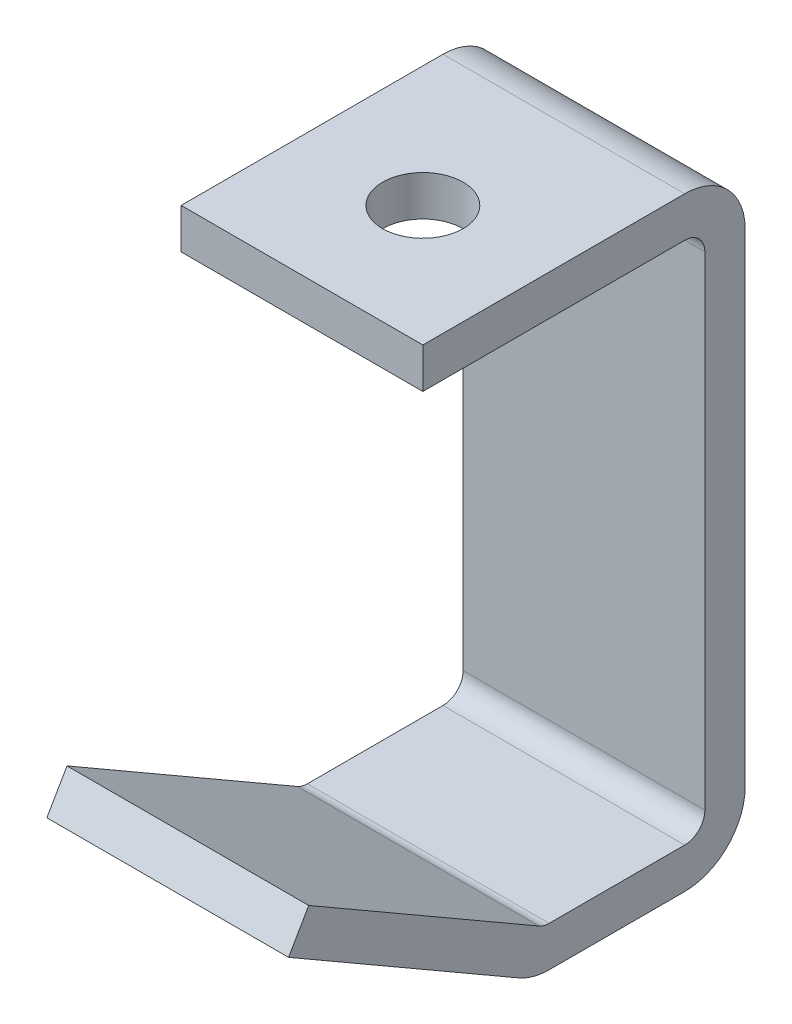
ISO-10303-21;
HEADER;
FILE_DESCRIPTION(('STEP AP214'),'2;1');
FILE_NAME('part.step','',(''),(''),'','','');
FILE_SCHEMA(('AUTOMOTIVE_DESIGN { 1 0 10303 214 1 1 1 1 }'));
ENDSEC;
DATA;
#1=APPLICATION_CONTEXT('core data for automotive mechanical design processes');
#2=APPLICATION_PROTOCOL_DEFINITION('international standard','automotive_design',2000,#1);
#3=PRODUCT_CONTEXT('',#1,'mechanical');
#4=PRODUCT('Part','Part','',(#3));
#5=PRODUCT_RELATED_PRODUCT_CATEGORY('part','',(#4));
#6=PRODUCT_DEFINITION_FORMATION('','',#4);
#7=PRODUCT_DEFINITION_CONTEXT('part definition',#1,'design');
#8=PRODUCT_DEFINITION('design','',#6,#7);
#9=PRODUCT_DEFINITION_SHAPE('','',#8);
#10=(LENGTH_UNIT() NAMED_UNIT(*) SI_UNIT(.MILLI.,.METRE.));
#11=(NAMED_UNIT(*) PLANE_ANGLE_UNIT() SI_UNIT($,.RADIAN.));
#12=(NAMED_UNIT(*) SI_UNIT($,.STERADIAN.) SOLID_ANGLE_UNIT());
#13=UNCERTAINTY_MEASURE_WITH_UNIT(LENGTH_MEASURE(1.E-05),#10,'distance_accuracy_value','');
#14=(GEOMETRIC_REPRESENTATION_CONTEXT(3) GLOBAL_UNCERTAINTY_ASSIGNED_CONTEXT((#13)) GLOBAL_UNIT_ASSIGNED_CONTEXT((#10,
#11,#12)) REPRESENTATION_CONTEXT('',''));
#15=CARTESIAN_POINT('',(0.,0.,0.));
#16=DIRECTION('',(0.,0.,1.));
#17=DIRECTION('',(1.,0.,0.));
#18=AXIS2_PLACEMENT_3D('',#15,#16,#17);
#19=CARTESIAN_POINT('',(38.1,95.25,6.34999999999995));
#20=DIRECTION('',(0.,0.,-1.));
#21=DIRECTION('',(0.,1.,0.));
#22=AXIS2_PLACEMENT_3D('',#19,#20,#21);
#23=PLANE('',#22);
#24=DIRECTION('',(0.,-1.,0.));
#25=VECTOR('',#24,1.);
#26=CARTESIAN_POINT('',(0.,95.25,6.34999999999995));
#27=LINE('',#26,#25);
#28=CARTESIAN_POINT('',(0.,85.7250000000001,6.34999999999996));
#29=VERTEX_POINT('',#28);
#30=CARTESIAN_POINT('',(0.,9.52499999999998,6.35000000000001));
#31=VERTEX_POINT('',#30);
#32=EDGE_CURVE('E182',#29,#31,#27,.T.);
#33=ORIENTED_EDGE('',*,*,#32,.T.);
#34=DIRECTION('',(1.,0.,0.));
#35=VECTOR('',#34,1.);
#36=CARTESIAN_POINT('',(38.1,9.52499999999998,6.35000000000001));
#37=LINE('',#36,#35);
#38=CARTESIAN_POINT('',(38.1,9.52499999999998,6.35000000000001));
#39=VERTEX_POINT('',#38);
#40=EDGE_CURVE('E227',#31,#39,#37,.T.);
#41=ORIENTED_EDGE('',*,*,#40,.T.);
#42=DIRECTION('',(0.,-1.,0.));
#43=VECTOR('',#42,1.);
#44=CARTESIAN_POINT('',(38.1,95.25,6.34999999999995));
#45=LINE('',#44,#43);
#46=CARTESIAN_POINT('',(38.1,85.7250000000001,6.34999999999996));
#47=VERTEX_POINT('',#46);
#48=EDGE_CURVE('E185',#47,#39,#45,.T.);
#49=ORIENTED_EDGE('',*,*,#48,.F.);
#50=DIRECTION('',(1.,0.,0.));
#51=VECTOR('',#50,1.);
#52=CARTESIAN_POINT('',(0.,85.7250000000001,6.34999999999996));
#53=LINE('',#52,#51);
#54=EDGE_CURVE('E223',#47,#29,#53,.F.);
#55=ORIENTED_EDGE('',*,*,#54,.T.);
#56=EDGE_LOOP('',(#33,#41,#49,#55));
#57=FACE_BOUND('',#56,.T.);
#58=ADVANCED_FACE('F35',(#57),#23,.F.);
#59=CARTESIAN_POINT('',(0.,6.34999999999998,0.));
#60=DIRECTION('',(0.,1.,0.));
#61=DIRECTION('',(0.,0.,1.));
#62=AXIS2_PLACEMENT_3D('',#59,#60,#61);
#63=PLANE('',#62);
#64=DIRECTION('',(0.,0.,1.));
#65=VECTOR('',#64,1.);
#66=CARTESIAN_POINT('',(38.1,6.34999999999998,0.));
#67=LINE('',#66,#65);
#68=CARTESIAN_POINT('',(38.1,6.34999999999999,9.52500000000001));
#69=VERTEX_POINT('',#68);
#70=CARTESIAN_POINT('',(38.1,6.35,30.8992613140312));
#71=VERTEX_POINT('',#70);
#72=EDGE_CURVE('E212',#69,#71,#67,.T.);
#73=ORIENTED_EDGE('',*,*,#72,.F.);
#74=DIRECTION('',(1.,0.,0.));
#75=VECTOR('',#74,1.);
#76=CARTESIAN_POINT('',(0.,6.34999999999999,9.52500000000001));
#77=LINE('',#76,#75);
#78=CARTESIAN_POINT('',(0.,6.34999999999999,9.52500000000001));
#79=VERTEX_POINT('',#78);
#80=EDGE_CURVE('E233',#69,#79,#77,.F.);
#81=ORIENTED_EDGE('',*,*,#80,.T.);
#82=DIRECTION('',(0.,0.,1.));
#83=VECTOR('',#82,1.);
#84=CARTESIAN_POINT('',(0.,6.34999999999998,0.));
#85=LINE('',#84,#83);
#86=CARTESIAN_POINT('',(0.,6.35,30.8992613140312));
#87=VERTEX_POINT('',#86);
#88=EDGE_CURVE('E195',#79,#87,#85,.T.);
#89=ORIENTED_EDGE('',*,*,#88,.T.);
#90=DIRECTION('',(1.,0.,0.));
#91=VECTOR('',#90,1.);
#92=CARTESIAN_POINT('',(38.1,6.35,30.8992613140312));
#93=LINE('',#92,#91);
#94=EDGE_CURVE('E230',#87,#71,#93,.T.);
#95=ORIENTED_EDGE('',*,*,#94,.T.);
#96=EDGE_LOOP('',(#73,#81,#89,#95));
#97=FACE_BOUND('',#96,.T.);
#98=ADVANCED_FACE('F299',(#97),#63,.T.);
#99=CARTESIAN_POINT('',(0.,0.,33.4514773719376));
#100=DIRECTION('',(0.,-1.,0.));
#101=DIRECTION('',(0.,0.,-1.));
#102=AXIS2_PLACEMENT_3D('',#99,#100,#101);
#103=PLANE('',#102);
#104=DIRECTION('',(0.,0.,-1.));
#105=VECTOR('',#104,1.);
#106=CARTESIAN_POINT('',(38.1,0.,33.4514773719376));
#107=LINE('',#106,#105);
#108=CARTESIAN_POINT('',(38.1,0.,30.8992613140311));
#109=VERTEX_POINT('',#108);
#110=CARTESIAN_POINT('',(38.1,0.,9.525));
#111=VERTEX_POINT('',#110);
#112=EDGE_CURVE('E188',#109,#111,#107,.T.);
#113=ORIENTED_EDGE('',*,*,#112,.F.);
#114=DIRECTION('',(1.,0.,0.));
#115=VECTOR('',#114,1.);
#116=CARTESIAN_POINT('',(0.,0.,30.8992613140311));
#117=LINE('',#116,#115);
#118=CARTESIAN_POINT('',(0.,0.,30.8992613140311));
#119=VERTEX_POINT('',#118);
#120=EDGE_CURVE('E262',#109,#119,#117,.F.);
#121=ORIENTED_EDGE('',*,*,#120,.T.);
#122=DIRECTION('',(0.,0.,-1.));
#123=VECTOR('',#122,1.);
#124=CARTESIAN_POINT('',(0.,0.,33.4514773719376));
#125=LINE('',#124,#123);
#126=CARTESIAN_POINT('',(0.,0.,9.525));
#127=VERTEX_POINT('',#126);
#128=EDGE_CURVE('E189',#119,#127,#125,.T.);
#129=ORIENTED_EDGE('',*,*,#128,.T.);
#130=DIRECTION('',(1.,0.,0.));
#131=VECTOR('',#130,1.);
#132=CARTESIAN_POINT('',(0.,0.,9.525));
#133=LINE('',#132,#131);
#134=EDGE_CURVE('E259',#127,#111,#133,.T.);
#135=ORIENTED_EDGE('',*,*,#134,.T.);
#136=EDGE_LOOP('',(#113,#121,#129,#135));
#137=FACE_BOUND('',#136,.T.);
#138=ADVANCED_FACE('F304',(#137),#103,.T.);
#139=CARTESIAN_POINT('',(0.,22.2375386859689,71.968024211314));
#140=DIRECTION('',(0.,-0.866025403784438,0.500000000000001));
#141=DIRECTION('',(0.,-0.500000000000001,-0.866025403784438));
#142=AXIS2_PLACEMENT_3D('',#139,#140,#141);
#143=PLANE('',#142);
#144=DIRECTION('',(0.,-0.500000000000001,-0.866025403784438));
#145=VECTOR('',#144,1.);
#146=CARTESIAN_POINT('',(0.,22.2375386859689,71.968024211314));
#147=LINE('',#146,#145);
#148=CARTESIAN_POINT('',(0.,22.2375386859689,71.968024211314));
#149=VERTEX_POINT('',#148);
#150=CARTESIAN_POINT('',(0.,1.27610802895322,35.6617613140312));
#151=VERTEX_POINT('',#150);
#152=EDGE_CURVE('E203',#149,#151,#147,.T.);
#153=ORIENTED_EDGE('',*,*,#152,.T.);
#154=DIRECTION('',(1.,0.,0.));
#155=VECTOR('',#154,1.);
#156=CARTESIAN_POINT('',(0.,1.27610802895322,35.6617613140312));
#157=LINE('',#156,#155);
#158=CARTESIAN_POINT('',(38.1,1.27610802895322,35.6617613140312));
#159=VERTEX_POINT('',#158);
#160=EDGE_CURVE('E250',#151,#159,#157,.T.);
#161=ORIENTED_EDGE('',*,*,#160,.T.);
#162=DIRECTION('',(0.,-0.500000000000001,-0.866025403784438));
#163=VECTOR('',#162,1.);
#164=CARTESIAN_POINT('',(38.1,22.2375386859689,71.968024211314));
#165=LINE('',#164,#163);
#166=CARTESIAN_POINT('',(38.1,22.2375386859689,71.968024211314));
#167=VERTEX_POINT('',#166);
#168=EDGE_CURVE('E193',#167,#159,#165,.T.);
#169=ORIENTED_EDGE('',*,*,#168,.F.);
#170=DIRECTION('',(1.,0.,0.));
#171=VECTOR('',#170,1.);
#172=CARTESIAN_POINT('',(0.,22.2375386859689,71.968024211314));
#173=LINE('',#172,#171);
#174=EDGE_CURVE('E221',#149,#167,#173,.T.);
#175=ORIENTED_EDGE('',*,*,#174,.F.);
#176=EDGE_LOOP('',(#153,#161,#169,#175));
#177=FACE_BOUND('',#176,.T.);
#178=ADVANCED_FACE('F311',(#177),#143,.T.);
#179=CARTESIAN_POINT('',(0.,27.7368,68.793024211314));
#180=DIRECTION('',(0.,0.500000000000002,0.866025403784437));
#181=DIRECTION('',(0.,-0.866025403784438,0.500000000000002));
#182=AXIS2_PLACEMENT_3D('',#179,#180,#181);
#183=PLANE('',#182);
#184=DIRECTION('',(0.,-0.866025403784437,0.500000000000002));
#185=VECTOR('',#184,1.);
#186=CARTESIAN_POINT('',(38.1,27.7368,68.793024211314));
#187=LINE('',#186,#185);
#188=CARTESIAN_POINT('',(38.1,27.7368,68.793024211314));
#189=VERTEX_POINT('',#188);
#190=EDGE_CURVE('E217',#189,#167,#187,.T.);
#191=ORIENTED_EDGE('',*,*,#190,.F.);
#192=DIRECTION('',(1.,0.,0.));
#193=VECTOR('',#192,1.);
#194=CARTESIAN_POINT('',(0.,27.7368,68.793024211314));
#195=LINE('',#194,#193);
#196=CARTESIAN_POINT('',(0.,27.7368,68.793024211314));
#197=VERTEX_POINT('',#196);
#198=EDGE_CURVE('E206',#197,#189,#195,.T.);
#199=ORIENTED_EDGE('',*,*,#198,.F.);
#200=DIRECTION('',(0.,-0.866025403784437,0.500000000000002));
#201=VECTOR('',#200,1.);
#202=CARTESIAN_POINT('',(0.,27.7368,68.793024211314));
#203=LINE('',#202,#201);
#204=EDGE_CURVE('E200',#197,#149,#203,.T.);
#205=ORIENTED_EDGE('',*,*,#204,.T.);
#206=ORIENTED_EDGE('',*,*,#174,.T.);
#207=EDGE_LOOP('',(#191,#199,#205,#206));
#208=FACE_BOUND('',#207,.T.);
#209=ADVANCED_FACE('F314',(#208),#183,.T.);
#210=CARTESIAN_POINT('',(0.,6.35,31.75));
#211=DIRECTION('',(0.,0.866025403784438,-0.5));
#212=DIRECTION('',(0.,0.5,0.866025403784438));
#213=AXIS2_PLACEMENT_3D('',#210,#211,#212);
#214=PLANE('',#213);
#215=DIRECTION('',(0.,0.5,0.866025403784438));
#216=VECTOR('',#215,1.);
#217=CARTESIAN_POINT('',(38.1,6.35,31.75));
#218=LINE('',#217,#216);
#219=CARTESIAN_POINT('',(38.1,6.77536934298441,32.4867613140312));
#220=VERTEX_POINT('',#219);
#221=EDGE_CURVE('E215',#220,#189,#218,.T.);
#222=ORIENTED_EDGE('',*,*,#221,.F.);
#223=DIRECTION('',(1.,0.,0.));
#224=VECTOR('',#223,1.);
#225=CARTESIAN_POINT('',(0.,6.77536934298441,32.4867613140312));
#226=LINE('',#225,#224);
#227=CARTESIAN_POINT('',(0.,6.77536934298441,32.4867613140312));
#228=VERTEX_POINT('',#227);
#229=EDGE_CURVE('E235',#220,#228,#226,.F.);
#230=ORIENTED_EDGE('',*,*,#229,.T.);
#231=DIRECTION('',(0.,0.5,0.866025403784438));
#232=VECTOR('',#231,1.);
#233=CARTESIAN_POINT('',(0.,6.35,31.75));
#234=LINE('',#233,#232);
#235=EDGE_CURVE('E198',#228,#197,#234,.T.);
#236=ORIENTED_EDGE('',*,*,#235,.T.);
#237=ORIENTED_EDGE('',*,*,#198,.T.);
#238=EDGE_LOOP('',(#222,#230,#236,#237));
#239=FACE_BOUND('',#238,.T.);
#240=ADVANCED_FACE('F318',(#239),#214,.T.);
#241=CARTESIAN_POINT('',(0.,0.,0.));
#242=DIRECTION('',(0.,0.,-1.));
#243=DIRECTION('',(-1.,0.,0.));
#244=AXIS2_PLACEMENT_3D('',#241,#242,#243);
#245=PLANE('',#244);
#246=DIRECTION('',(0.,1.,0.));
#247=VECTOR('',#246,1.);
#248=CARTESIAN_POINT('',(0.,0.,0.));
#249=LINE('',#248,#247);
#250=CARTESIAN_POINT('',(0.,9.525,0.));
#251=VERTEX_POINT('',#250);
#252=CARTESIAN_POINT('',(0.,85.725,0.));
#253=VERTEX_POINT('',#252);
#254=EDGE_CURVE('E192',#251,#253,#249,.T.);
#255=ORIENTED_EDGE('',*,*,#254,.T.);
#256=DIRECTION('',(-1.,0.,0.));
#257=VECTOR('',#256,1.);
#258=CARTESIAN_POINT('',(38.1,85.725,0.));
#259=LINE('',#258,#257);
#260=CARTESIAN_POINT('',(38.1,85.725,0.));
#261=VERTEX_POINT('',#260);
#262=EDGE_CURVE('E11',#253,#261,#259,.F.);
#263=ORIENTED_EDGE('',*,*,#262,.T.);
#264=DIRECTION('',(0.,1.,0.));
#265=VECTOR('',#264,1.);
#266=CARTESIAN_POINT('',(38.1,0.,0.));
#267=LINE('',#266,#265);
#268=CARTESIAN_POINT('',(38.1,9.525,0.));
#269=VERTEX_POINT('',#268);
#270=EDGE_CURVE('E209',#269,#261,#267,.T.);
#271=ORIENTED_EDGE('',*,*,#270,.F.);
#272=DIRECTION('',(1.,0.,0.));
#273=VECTOR('',#272,1.);
#274=CARTESIAN_POINT('',(0.,9.525,0.));
#275=LINE('',#274,#273);
#276=EDGE_CURVE('E43',#269,#251,#275,.F.);
#277=ORIENTED_EDGE('',*,*,#276,.T.);
#278=EDGE_LOOP('',(#255,#263,#271,#277));
#279=FACE_BOUND('',#278,.T.);
#280=ADVANCED_FACE('F309',(#279),#245,.T.);
#281=CARTESIAN_POINT('',(0.,0.,0.));
#282=DIRECTION('',(1.,0.,0.));
#283=DIRECTION('',(0.,0.,-1.));
#284=AXIS2_PLACEMENT_3D('',#281,#282,#283);
#285=PLANE('',#284);
#286=ORIENTED_EDGE('',*,*,#128,.F.);
#287=CARTESIAN_POINT('',(0.,9.52499999999999,30.8992613140311));
#288=DIRECTION('',(1.,0.,0.));
#289=DIRECTION('',(0.,0.,-1.));
#290=AXIS2_PLACEMENT_3D('',#287,#288,#289);
#291=CIRCLE('',#290,9.525);
#292=EDGE_CURVE('E267',#119,#151,#291,.F.);
#293=ORIENTED_EDGE('',*,*,#292,.T.);
#294=ORIENTED_EDGE('',*,*,#152,.F.);
#295=ORIENTED_EDGE('',*,*,#204,.F.);
#296=ORIENTED_EDGE('',*,*,#235,.F.);
#297=CARTESIAN_POINT('',(0.,9.525,30.8992613140312));
#298=DIRECTION('',(1.,0.,0.));
#299=DIRECTION('',(0.,0.,-1.));
#300=AXIS2_PLACEMENT_3D('',#297,#298,#299);
#301=CIRCLE('',#300,3.175);
#302=EDGE_CURVE('E244',#228,#87,#301,.T.);
#303=ORIENTED_EDGE('',*,*,#302,.T.);
#304=ORIENTED_EDGE('',*,*,#88,.F.);
#305=CARTESIAN_POINT('',(0.,9.52499999999998,9.52500000000001));
#306=DIRECTION('',(1.,0.,0.));
#307=DIRECTION('',(0.,0.,-1.));
#308=AXIS2_PLACEMENT_3D('',#305,#306,#307);
#309=CIRCLE('',#308,3.175);
#310=EDGE_CURVE('E240',#79,#31,#309,.T.);
#311=ORIENTED_EDGE('',*,*,#310,.T.);
#312=ORIENTED_EDGE('',*,*,#32,.F.);
#313=CARTESIAN_POINT('',(0.,85.7250000000001,9.52499999999996));
#314=DIRECTION('',(1.,0.,0.));
#315=DIRECTION('',(0.,0.,-1.));
#316=AXIS2_PLACEMENT_3D('',#313,#314,#315);
#317=CIRCLE('',#316,3.175);
#318=CARTESIAN_POINT('',(0.,88.9000000000001,9.52499999999996));
#319=VERTEX_POINT('',#318);
#320=EDGE_CURVE('E248',#29,#319,#317,.T.);
#321=ORIENTED_EDGE('',*,*,#320,.T.);
#322=DIRECTION('',(0.,0.,-1.));
#323=VECTOR('',#322,1.);
#324=CARTESIAN_POINT('',(0.,88.9000000000001,50.8));
#325=LINE('',#324,#323);
#326=CARTESIAN_POINT('',(0.,88.9000000000001,50.8));
#327=VERTEX_POINT('',#326);
#328=EDGE_CURVE('E174',#327,#319,#325,.T.);
#329=ORIENTED_EDGE('',*,*,#328,.F.);
#330=DIRECTION('',(0.,-1.,0.));
#331=VECTOR('',#330,1.);
#332=CARTESIAN_POINT('',(0.,88.9000000000001,50.8));
#333=LINE('',#332,#331);
#334=CARTESIAN_POINT('',(0.,95.2500000000001,50.8));
#335=VERTEX_POINT('',#334);
#336=EDGE_CURVE('E164',#335,#327,#333,.T.);
#337=ORIENTED_EDGE('',*,*,#336,.F.);
#338=DIRECTION('',(0.,0.,1.));
#339=VECTOR('',#338,1.);
#340=CARTESIAN_POINT('',(0.,95.25,6.34999999999995));
#341=LINE('',#340,#339);
#342=CARTESIAN_POINT('',(0.,95.25,9.52499999999999));
#343=VERTEX_POINT('',#342);
#344=EDGE_CURVE('E176',#343,#335,#341,.T.);
#345=ORIENTED_EDGE('',*,*,#344,.F.);
#346=CARTESIAN_POINT('',(0.,85.725,9.525));
#347=DIRECTION('',(1.,0.,0.));
#348=DIRECTION('',(0.,0.,-1.));
#349=AXIS2_PLACEMENT_3D('',#346,#347,#348);
#350=CIRCLE('',#349,9.525);
#351=EDGE_CURVE('E50',#343,#253,#350,.F.);
#352=ORIENTED_EDGE('',*,*,#351,.T.);
#353=ORIENTED_EDGE('',*,*,#254,.F.);
#354=CARTESIAN_POINT('',(0.,9.525,9.525));
#355=DIRECTION('',(1.,0.,0.));
#356=DIRECTION('',(0.,0.,-1.));
#357=AXIS2_PLACEMENT_3D('',#354,#355,#356);
#358=CIRCLE('',#357,9.525);
#359=EDGE_CURVE('E264',#251,#127,#358,.F.);
#360=ORIENTED_EDGE('',*,*,#359,.T.);
#361=EDGE_LOOP('',(#286,#293,#294,#295,#296,#303,#304,#311,#312,#321,#329,#337,#345,#352,#353,#360));
#362=FACE_BOUND('',#361,.T.);
#363=ADVANCED_FACE('F277',(#362),#285,.F.);
#364=CARTESIAN_POINT('',(38.1,0.,0.));
#365=DIRECTION('',(1.,0.,0.));
#366=DIRECTION('',(0.,0.,-1.));
#367=AXIS2_PLACEMENT_3D('',#364,#365,#366);
#368=PLANE('',#367);
#369=ORIENTED_EDGE('',*,*,#168,.T.);
#370=CARTESIAN_POINT('',(38.1,9.52499999999999,30.8992613140311));
#371=DIRECTION('',(1.,0.,0.));
#372=DIRECTION('',(0.,0.,-1.));
#373=AXIS2_PLACEMENT_3D('',#370,#371,#372);
#374=CIRCLE('',#373,9.525);
#375=EDGE_CURVE('E257',#159,#109,#374,.T.);
#376=ORIENTED_EDGE('',*,*,#375,.T.);
#377=ORIENTED_EDGE('',*,*,#112,.T.);
#378=CARTESIAN_POINT('',(38.1,9.525,9.525));
#379=DIRECTION('',(1.,0.,0.));
#380=DIRECTION('',(0.,0.,-1.));
#381=AXIS2_PLACEMENT_3D('',#378,#379,#380);
#382=CIRCLE('',#381,9.525);
#383=EDGE_CURVE('E253',#111,#269,#382,.T.);
#384=ORIENTED_EDGE('',*,*,#383,.T.);
#385=ORIENTED_EDGE('',*,*,#270,.T.);
#386=CARTESIAN_POINT('',(38.1,85.725,9.525));
#387=DIRECTION('',(1.,0.,0.));
#388=DIRECTION('',(0.,0.,-1.));
#389=AXIS2_PLACEMENT_3D('',#386,#387,#388);
#390=CIRCLE('',#389,9.525);
#391=CARTESIAN_POINT('',(38.1,95.25,9.52499999999999));
#392=VERTEX_POINT('',#391);
#393=EDGE_CURVE('E255',#261,#392,#390,.T.);
#394=ORIENTED_EDGE('',*,*,#393,.T.);
#395=DIRECTION('',(0.,0.,-1.));
#396=VECTOR('',#395,1.);
#397=CARTESIAN_POINT('',(38.1,95.25,0.));
#398=LINE('',#397,#396);
#399=CARTESIAN_POINT('',(38.1,95.2500000000001,50.8));
#400=VERTEX_POINT('',#399);
#401=EDGE_CURVE('E154',#400,#392,#398,.T.);
#402=ORIENTED_EDGE('',*,*,#401,.F.);
#403=DIRECTION('',(0.,1.,0.));
#404=VECTOR('',#403,1.);
#405=CARTESIAN_POINT('',(38.1,95.2500000000001,50.8));
#406=LINE('',#405,#404);
#407=CARTESIAN_POINT('',(38.1,88.9000000000001,50.8));
#408=VERTEX_POINT('',#407);
#409=EDGE_CURVE('E147',#408,#400,#406,.T.);
#410=ORIENTED_EDGE('',*,*,#409,.F.);
#411=DIRECTION('',(0.,0.,-1.));
#412=VECTOR('',#411,1.);
#413=CARTESIAN_POINT('',(38.1,88.9000000000001,50.8));
#414=LINE('',#413,#412);
#415=CARTESIAN_POINT('',(38.1,88.9000000000001,9.52499999999996));
#416=VERTEX_POINT('',#415);
#417=EDGE_CURVE('E152',#408,#416,#414,.T.);
#418=ORIENTED_EDGE('',*,*,#417,.T.);
#419=CARTESIAN_POINT('',(38.1,85.7250000000001,9.52499999999996));
#420=DIRECTION('',(1.,0.,0.));
#421=DIRECTION('',(0.,0.,-1.));
#422=AXIS2_PLACEMENT_3D('',#419,#420,#421);
#423=CIRCLE('',#422,3.175);
#424=EDGE_CURVE('E246',#416,#47,#423,.F.);
#425=ORIENTED_EDGE('',*,*,#424,.T.);
#426=ORIENTED_EDGE('',*,*,#48,.T.);
#427=CARTESIAN_POINT('',(38.1,9.52499999999998,9.52500000000001));
#428=DIRECTION('',(1.,0.,0.));
#429=DIRECTION('',(0.,0.,-1.));
#430=AXIS2_PLACEMENT_3D('',#427,#428,#429);
#431=CIRCLE('',#430,3.175);
#432=EDGE_CURVE('E238',#39,#69,#431,.F.);
#433=ORIENTED_EDGE('',*,*,#432,.T.);
#434=ORIENTED_EDGE('',*,*,#72,.T.);
#435=CARTESIAN_POINT('',(38.1,9.525,30.8992613140312));
#436=DIRECTION('',(1.,0.,0.));
#437=DIRECTION('',(0.,0.,-1.));
#438=AXIS2_PLACEMENT_3D('',#435,#436,#437);
#439=CIRCLE('',#438,3.175);
#440=EDGE_CURVE('E242',#71,#220,#439,.F.);
#441=ORIENTED_EDGE('',*,*,#440,.T.);
#442=ORIENTED_EDGE('',*,*,#221,.T.);
#443=ORIENTED_EDGE('',*,*,#190,.T.);
#444=EDGE_LOOP('',(#369,#376,#377,#384,#385,#394,#402,#410,#418,#425,#426,#433,#434,#441,#442,#443));
#445=FACE_BOUND('',#444,.T.);
#446=ADVANCED_FACE('F150',(#445),#368,.T.);
#447=CARTESIAN_POINT('',(0.,95.25,0.));
#448=DIRECTION('',(0.,-1.,0.));
#449=DIRECTION('',(0.,0.,-1.));
#450=AXIS2_PLACEMENT_3D('',#447,#448,#449);
#451=PLANE('',#450);
#452=CARTESIAN_POINT('',(19.0500000000001,95.25,31.7499999999999));
#453=DIRECTION('',(0.,1.,0.));
#454=DIRECTION('',(0.,0.,1.));
#455=AXIS2_PLACEMENT_3D('',#452,#453,#454);
#456=CIRCLE('',#455,6.35000000000002);
#457=CARTESIAN_POINT('',(19.0500000000001,95.25,38.1));
#458=VERTEX_POINT('',#457);
#459=EDGE_CURVE('E282',#458,#458,#456,.T.);
#460=ORIENTED_EDGE('',*,*,#459,.F.);
#461=EDGE_LOOP('',(#460));
#462=FACE_BOUND('',#461,.T.);
#463=ORIENTED_EDGE('',*,*,#401,.T.);
#464=DIRECTION('',(-1.,0.,0.));
#465=VECTOR('',#464,1.);
#466=CARTESIAN_POINT('',(0.,95.25,9.52499999999999));
#467=LINE('',#466,#465);
#468=EDGE_CURVE('E269',#392,#343,#467,.T.);
#469=ORIENTED_EDGE('',*,*,#468,.T.);
#470=ORIENTED_EDGE('',*,*,#344,.T.);
#471=DIRECTION('',(-1.,0.,0.));
#472=VECTOR('',#471,1.);
#473=CARTESIAN_POINT('',(0.,95.2500000000001,50.8));
#474=LINE('',#473,#472);
#475=EDGE_CURVE('E158',#400,#335,#474,.T.);
#476=ORIENTED_EDGE('',*,*,#475,.F.);
#477=EDGE_LOOP('',(#463,#469,#470,#476));
#478=FACE_BOUND('',#477,.T.);
#479=ADVANCED_FACE('F273',(#462,#478),#451,.F.);
#480=CARTESIAN_POINT('',(38.1,88.9000000000001,50.8));
#481=DIRECTION('',(0.,1.,0.));
#482=DIRECTION('',(0.,0.,1.));
#483=AXIS2_PLACEMENT_3D('',#480,#481,#482);
#484=PLANE('',#483);
#485=CARTESIAN_POINT('',(19.0500000000001,88.9000000000001,31.7499999999999));
#486=DIRECTION('',(0.,1.,0.));
#487=DIRECTION('',(0.,0.,1.));
#488=AXIS2_PLACEMENT_3D('',#485,#486,#487);
#489=CIRCLE('',#488,6.35000000000002);
#490=CARTESIAN_POINT('',(19.0500000000001,88.9000000000001,38.1));
#491=VERTEX_POINT('',#490);
#492=EDGE_CURVE('E168',#491,#491,#489,.T.);
#493=ORIENTED_EDGE('',*,*,#492,.T.);
#494=EDGE_LOOP('',(#493));
#495=FACE_BOUND('',#494,.T.);
#496=ORIENTED_EDGE('',*,*,#328,.T.);
#497=DIRECTION('',(1.,0.,0.));
#498=VECTOR('',#497,1.);
#499=CARTESIAN_POINT('',(38.1,88.9000000000001,9.52499999999996));
#500=LINE('',#499,#498);
#501=EDGE_CURVE('E173',#319,#416,#500,.T.);
#502=ORIENTED_EDGE('',*,*,#501,.T.);
#503=ORIENTED_EDGE('',*,*,#417,.F.);
#504=DIRECTION('',(1.,0.,0.));
#505=VECTOR('',#504,1.);
#506=CARTESIAN_POINT('',(38.1,88.9000000000001,50.8));
#507=LINE('',#506,#505);
#508=EDGE_CURVE('E159',#327,#408,#507,.T.);
#509=ORIENTED_EDGE('',*,*,#508,.F.);
#510=EDGE_LOOP('',(#496,#502,#503,#509));
#511=FACE_BOUND('',#510,.T.);
#512=ADVANCED_FACE('F171',(#495,#511),#484,.F.);
#513=CARTESIAN_POINT('',(0.,0.,50.8));
#514=DIRECTION('',(0.,0.,-1.));
#515=DIRECTION('',(-1.,0.,0.));
#516=AXIS2_PLACEMENT_3D('',#513,#514,#515);
#517=PLANE('',#516);
#518=ORIENTED_EDGE('',*,*,#508,.T.);
#519=ORIENTED_EDGE('',*,*,#409,.T.);
#520=ORIENTED_EDGE('',*,*,#475,.T.);
#521=ORIENTED_EDGE('',*,*,#336,.T.);
#522=EDGE_LOOP('',(#518,#519,#520,#521));
#523=FACE_BOUND('',#522,.T.);
#524=ADVANCED_FACE('F162',(#523),#517,.F.);
#525=CARTESIAN_POINT('',(19.0500000000001,95.25,31.7499999999999));
#526=DIRECTION('',(0.,1.,0.));
#527=DIRECTION('',(0.,0.,1.));
#528=AXIS2_PLACEMENT_3D('',#525,#526,#527);
#529=CYLINDRICAL_SURFACE('',#528,6.35000000000002);
#530=ORIENTED_EDGE('',*,*,#492,.F.);
#531=EDGE_LOOP('',(#530));
#532=FACE_BOUND('',#531,.T.);
#533=ORIENTED_EDGE('',*,*,#459,.T.);
#534=EDGE_LOOP('',(#533));
#535=FACE_BOUND('',#534,.T.);
#536=ADVANCED_FACE('F286',(#532,#535),#529,.F.);
#537=CARTESIAN_POINT('',(38.1,9.52499999999998,9.52500000000001));
#538=DIRECTION('',(1.,0.,0.));
#539=DIRECTION('',(0.,0.,-1.));
#540=AXIS2_PLACEMENT_3D('',#537,#538,#539);
#541=CYLINDRICAL_SURFACE('',#540,3.175);
#542=ORIENTED_EDGE('',*,*,#310,.F.);
#543=ORIENTED_EDGE('',*,*,#80,.F.);
#544=ORIENTED_EDGE('',*,*,#432,.F.);
#545=ORIENTED_EDGE('',*,*,#40,.F.);
#546=EDGE_LOOP('',(#542,#543,#544,#545));
#547=FACE_BOUND('',#546,.T.);
#548=ADVANCED_FACE('F328',(#547),#541,.F.);
#549=CARTESIAN_POINT('',(0.,9.525,30.8992613140312));
#550=DIRECTION('',(-1.,0.,0.));
#551=DIRECTION('',(0.,0.,1.));
#552=AXIS2_PLACEMENT_3D('',#549,#550,#551);
#553=CYLINDRICAL_SURFACE('',#552,3.175);
#554=ORIENTED_EDGE('',*,*,#302,.F.);
#555=ORIENTED_EDGE('',*,*,#229,.F.);
#556=ORIENTED_EDGE('',*,*,#440,.F.);
#557=ORIENTED_EDGE('',*,*,#94,.F.);
#558=EDGE_LOOP('',(#554,#555,#556,#557));
#559=FACE_BOUND('',#558,.T.);
#560=ADVANCED_FACE('F331',(#559),#553,.F.);
#561=CARTESIAN_POINT('',(38.1,85.7250000000001,9.52499999999996));
#562=DIRECTION('',(-1.,0.,0.));
#563=DIRECTION('',(0.,0.,1.));
#564=AXIS2_PLACEMENT_3D('',#561,#562,#563);
#565=CYLINDRICAL_SURFACE('',#564,3.175);
#566=ORIENTED_EDGE('',*,*,#320,.F.);
#567=ORIENTED_EDGE('',*,*,#54,.F.);
#568=ORIENTED_EDGE('',*,*,#424,.F.);
#569=ORIENTED_EDGE('',*,*,#501,.F.);
#570=EDGE_LOOP('',(#566,#567,#568,#569));
#571=FACE_BOUND('',#570,.T.);
#572=ADVANCED_FACE('F335',(#571),#565,.F.);
#573=CARTESIAN_POINT('',(0.,9.52499999999999,30.8992613140311));
#574=DIRECTION('',(1.,0.,0.));
#575=DIRECTION('',(0.,0.,-1.));
#576=AXIS2_PLACEMENT_3D('',#573,#574,#575);
#577=CYLINDRICAL_SURFACE('',#576,9.525);
#578=ORIENTED_EDGE('',*,*,#292,.F.);
#579=ORIENTED_EDGE('',*,*,#120,.F.);
#580=ORIENTED_EDGE('',*,*,#375,.F.);
#581=ORIENTED_EDGE('',*,*,#160,.F.);
#582=EDGE_LOOP('',(#578,#579,#580,#581));
#583=FACE_BOUND('',#582,.T.);
#584=ADVANCED_FACE('F339',(#583),#577,.T.);
#585=CARTESIAN_POINT('',(0.,85.725,9.525));
#586=DIRECTION('',(1.,0.,0.));
#587=DIRECTION('',(0.,0.,-1.));
#588=AXIS2_PLACEMENT_3D('',#585,#586,#587);
#589=CYLINDRICAL_SURFACE('',#588,9.525);
#590=ORIENTED_EDGE('',*,*,#393,.F.);
#591=ORIENTED_EDGE('',*,*,#262,.F.);
#592=ORIENTED_EDGE('',*,*,#351,.F.);
#593=ORIENTED_EDGE('',*,*,#468,.F.);
#594=EDGE_LOOP('',(#590,#591,#592,#593));
#595=FACE_BOUND('',#594,.T.);
#596=ADVANCED_FACE('F342',(#595),#589,.T.);
#597=CARTESIAN_POINT('',(0.,9.525,9.525));
#598=DIRECTION('',(1.,0.,0.));
#599=DIRECTION('',(0.,0.,-1.));
#600=AXIS2_PLACEMENT_3D('',#597,#598,#599);
#601=CYLINDRICAL_SURFACE('',#600,9.525);
#602=ORIENTED_EDGE('',*,*,#359,.F.);
#603=ORIENTED_EDGE('',*,*,#276,.F.);
#604=ORIENTED_EDGE('',*,*,#383,.F.);
#605=ORIENTED_EDGE('',*,*,#134,.F.);
#606=EDGE_LOOP('',(#602,#603,#604,#605));
#607=FACE_BOUND('',#606,.T.);
#608=ADVANCED_FACE('F37',(#607),#601,.T.);
#609=CLOSED_SHELL('',(#58,#98,#138,#178,#209,#240,#280,#363,#446,#479,#512,#524,#536,#548,#560,
#572,#584,#596,#608));
#610=MANIFOLD_SOLID_BREP('B2',#609);
#611=ADVANCED_BREP_SHAPE_REPRESENTATION('',(#18,#610),#14);
#612=SHAPE_DEFINITION_REPRESENTATION(#9,#611);
ENDSEC;
END-ISO-10303-21;
